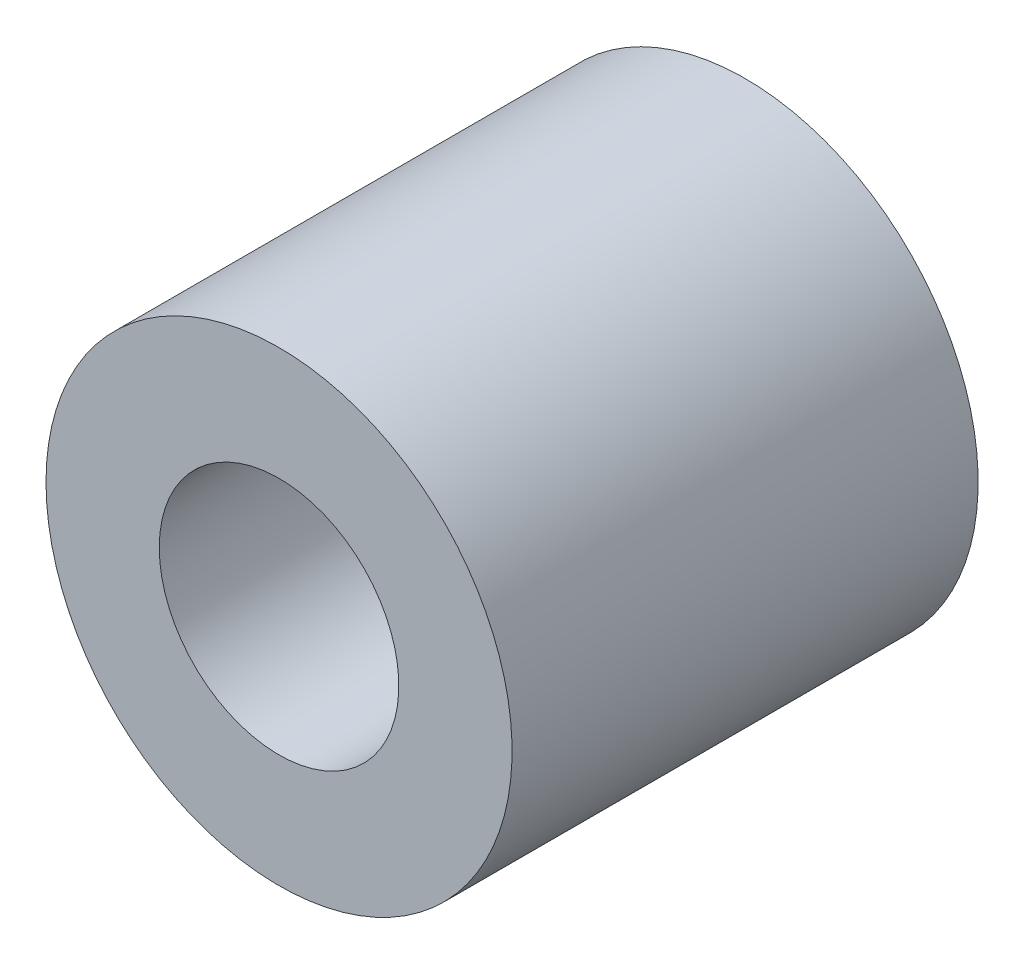
ISO-10303-21;
HEADER;
FILE_DESCRIPTION(('STEP AP214'),'2;1');
FILE_NAME('part.step','',(''),(''),'','','');
FILE_SCHEMA(('AUTOMOTIVE_DESIGN { 1 0 10303 214 1 1 1 1 }'));
ENDSEC;
DATA;
#1=APPLICATION_CONTEXT('core data for automotive mechanical design processes');
#2=APPLICATION_PROTOCOL_DEFINITION('international standard','automotive_design',2000,#1);
#3=PRODUCT_CONTEXT('',#1,'mechanical');
#4=PRODUCT('Part','Part','',(#3));
#5=PRODUCT_RELATED_PRODUCT_CATEGORY('part','',(#4));
#6=PRODUCT_DEFINITION_FORMATION('','',#4);
#7=PRODUCT_DEFINITION_CONTEXT('part definition',#1,'design');
#8=PRODUCT_DEFINITION('design','',#6,#7);
#9=PRODUCT_DEFINITION_SHAPE('','',#8);
#10=(LENGTH_UNIT() NAMED_UNIT(*) SI_UNIT(.MILLI.,.METRE.));
#11=(NAMED_UNIT(*) PLANE_ANGLE_UNIT() SI_UNIT($,.RADIAN.));
#12=(NAMED_UNIT(*) SI_UNIT($,.STERADIAN.) SOLID_ANGLE_UNIT());
#13=UNCERTAINTY_MEASURE_WITH_UNIT(LENGTH_MEASURE(1.E-05),#10,'distance_accuracy_value','');
#14=(GEOMETRIC_REPRESENTATION_CONTEXT(3) GLOBAL_UNCERTAINTY_ASSIGNED_CONTEXT((#13)) GLOBAL_UNIT_ASSIGNED_CONTEXT((#10,
#11,#12)) REPRESENTATION_CONTEXT('',''));
#15=CARTESIAN_POINT('',(0.,0.,0.));
#16=DIRECTION('',(0.,0.,1.));
#17=DIRECTION('',(1.,0.,0.));
#18=AXIS2_PLACEMENT_3D('',#15,#16,#17);
#19=CARTESIAN_POINT('',(-140.865724971035,9.525,1816.1));
#20=DIRECTION('',(0.,0.,-1.));
#21=DIRECTION('',(-1.,0.,0.));
#22=AXIS2_PLACEMENT_3D('',#19,#20,#21);
#23=CYLINDRICAL_SURFACE('',#22,3.2639);
#24=CARTESIAN_POINT('',(-140.865724971035,9.525,1816.1));
#25=DIRECTION('',(0.,0.,-1.));
#26=DIRECTION('',(-1.,0.,0.));
#27=AXIS2_PLACEMENT_3D('',#24,#25,#26);
#28=CIRCLE('',#27,3.2639);
#29=CARTESIAN_POINT('',(-144.129624971035,9.525,1816.1));
#30=VERTEX_POINT('',#29);
#31=EDGE_CURVE('E18',#30,#30,#28,.F.);
#32=ORIENTED_EDGE('',*,*,#31,.F.);
#33=EDGE_LOOP('',(#32));
#34=FACE_BOUND('',#33,.T.);
#35=CARTESIAN_POINT('',(-140.865724971035,9.525,1828.8));
#36=DIRECTION('',(0.,0.,-1.));
#37=DIRECTION('',(-1.,0.,0.));
#38=AXIS2_PLACEMENT_3D('',#35,#36,#37);
#39=CIRCLE('',#38,3.2639);
#40=CARTESIAN_POINT('',(-144.129624971035,9.525,1828.8));
#41=VERTEX_POINT('',#40);
#42=EDGE_CURVE('E27',#41,#41,#39,.F.);
#43=ORIENTED_EDGE('',*,*,#42,.T.);
#44=EDGE_LOOP('',(#43));
#45=FACE_BOUND('',#44,.T.);
#46=ADVANCED_FACE('F15',(#34,#45),#23,.F.);
#47=CARTESIAN_POINT('',(0.,0.,1816.1));
#48=DIRECTION('',(0.,0.,-1.));
#49=DIRECTION('',(-1.,0.,0.));
#50=AXIS2_PLACEMENT_3D('',#47,#48,#49);
#51=PLANE('',#50);
#52=ORIENTED_EDGE('',*,*,#31,.T.);
#53=EDGE_LOOP('',(#52));
#54=FACE_BOUND('',#53,.T.);
#55=CARTESIAN_POINT('',(-140.865724971035,9.525,1816.1));
#56=DIRECTION('',(0.,0.,-1.));
#57=DIRECTION('',(-1.,0.,0.));
#58=AXIS2_PLACEMENT_3D('',#55,#56,#57);
#59=CIRCLE('',#58,6.35);
#60=CARTESIAN_POINT('',(-147.215724971035,9.525,1816.1));
#61=VERTEX_POINT('',#60);
#62=EDGE_CURVE('E22',#61,#61,#59,.F.);
#63=ORIENTED_EDGE('',*,*,#62,.F.);
#64=EDGE_LOOP('',(#63));
#65=FACE_BOUND('',#64,.T.);
#66=ADVANCED_FACE('F35',(#54,#65),#51,.T.);
#67=CARTESIAN_POINT('',(0.,0.,1828.8));
#68=DIRECTION('',(0.,0.,-1.));
#69=DIRECTION('',(-1.,0.,0.));
#70=AXIS2_PLACEMENT_3D('',#67,#68,#69);
#71=PLANE('',#70);
#72=ORIENTED_EDGE('',*,*,#42,.F.);
#73=EDGE_LOOP('',(#72));
#74=FACE_BOUND('',#73,.T.);
#75=CARTESIAN_POINT('',(-140.865724971035,9.525,1828.8));
#76=DIRECTION('',(0.,0.,-1.));
#77=DIRECTION('',(-1.,0.,0.));
#78=AXIS2_PLACEMENT_3D('',#75,#76,#77);
#79=CIRCLE('',#78,6.35);
#80=CARTESIAN_POINT('',(-147.215724971035,9.525,1828.8));
#81=VERTEX_POINT('',#80);
#82=EDGE_CURVE('E10',#81,#81,#79,.T.);
#83=ORIENTED_EDGE('',*,*,#82,.F.);
#84=EDGE_LOOP('',(#83));
#85=FACE_BOUND('',#84,.T.);
#86=ADVANCED_FACE('F43',(#74,#85),#71,.F.);
#87=CARTESIAN_POINT('',(-140.865724971035,9.525,1816.1));
#88=DIRECTION('',(0.,0.,-1.));
#89=DIRECTION('',(-1.,0.,0.));
#90=AXIS2_PLACEMENT_3D('',#87,#88,#89);
#91=CYLINDRICAL_SURFACE('',#90,6.35);
#92=ORIENTED_EDGE('',*,*,#62,.T.);
#93=EDGE_LOOP('',(#92));
#94=FACE_BOUND('',#93,.T.);
#95=ORIENTED_EDGE('',*,*,#82,.T.);
#96=EDGE_LOOP('',(#95));
#97=FACE_BOUND('',#96,.T.);
#98=ADVANCED_FACE('F44',(#94,#97),#91,.T.);
#99=CLOSED_SHELL('',(#46,#66,#86,#98));
#100=MANIFOLD_SOLID_BREP('B1',#99);
#101=ADVANCED_BREP_SHAPE_REPRESENTATION('',(#18,#100),#14);
#102=SHAPE_DEFINITION_REPRESENTATION(#9,#101);
ENDSEC;
END-ISO-10303-21;
